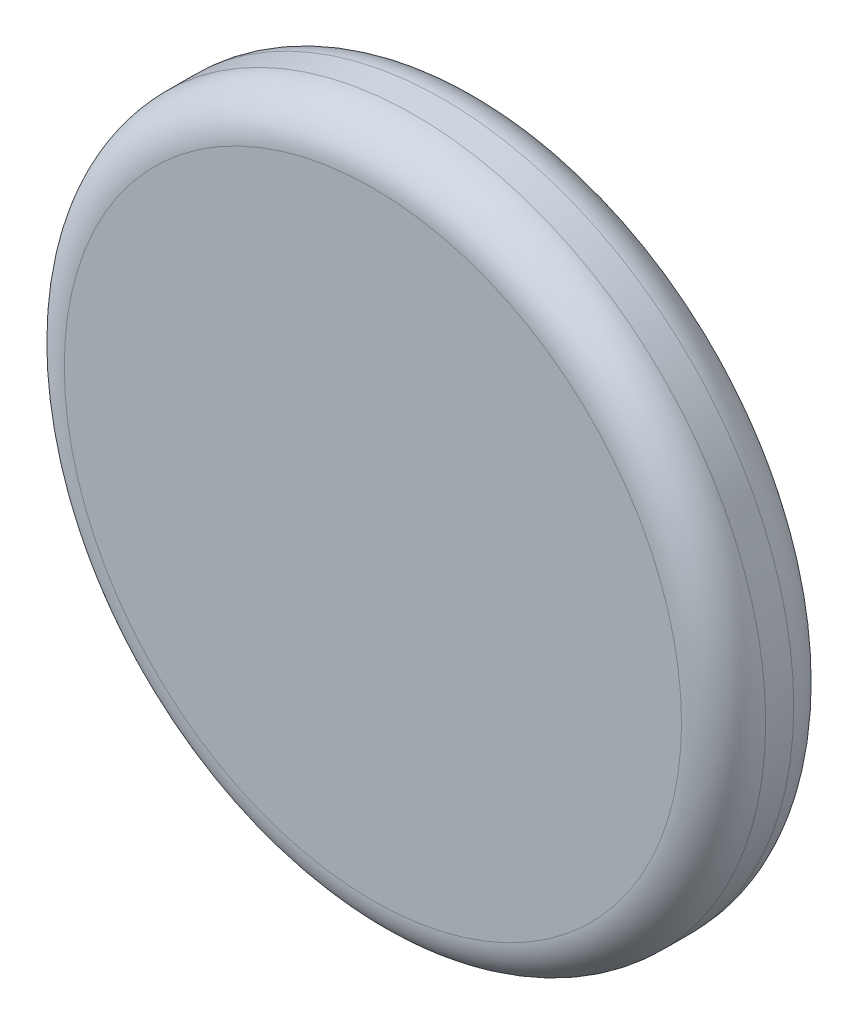
ISO-10303-21;
HEADER;
FILE_DESCRIPTION(('STEP AP214'),'2;1');
FILE_NAME('part.step','',(''),(''),'','','');
FILE_SCHEMA(('AUTOMOTIVE_DESIGN { 1 0 10303 214 1 1 1 1 }'));
ENDSEC;
DATA;
#1=APPLICATION_CONTEXT('core data for automotive mechanical design processes');
#2=APPLICATION_PROTOCOL_DEFINITION('international standard','automotive_design',2000,#1);
#3=PRODUCT_CONTEXT('',#1,'mechanical');
#4=PRODUCT('Part','Part','',(#3));
#5=PRODUCT_RELATED_PRODUCT_CATEGORY('part','',(#4));
#6=PRODUCT_DEFINITION_FORMATION('','',#4);
#7=PRODUCT_DEFINITION_CONTEXT('part definition',#1,'design');
#8=PRODUCT_DEFINITION('design','',#6,#7);
#9=PRODUCT_DEFINITION_SHAPE('','',#8);
#10=(LENGTH_UNIT() NAMED_UNIT(*) SI_UNIT(.MILLI.,.METRE.));
#11=(NAMED_UNIT(*) PLANE_ANGLE_UNIT() SI_UNIT($,.RADIAN.));
#12=(NAMED_UNIT(*) SI_UNIT($,.STERADIAN.) SOLID_ANGLE_UNIT());
#13=UNCERTAINTY_MEASURE_WITH_UNIT(LENGTH_MEASURE(1.E-05),#10,'distance_accuracy_value','');
#14=(GEOMETRIC_REPRESENTATION_CONTEXT(3) GLOBAL_UNCERTAINTY_ASSIGNED_CONTEXT((#13)) GLOBAL_UNIT_ASSIGNED_CONTEXT((#10,
#11,#12)) REPRESENTATION_CONTEXT('',''));
#15=CARTESIAN_POINT('',(0.,0.,0.));
#16=DIRECTION('',(0.,0.,1.));
#17=DIRECTION('',(1.,0.,0.));
#18=AXIS2_PLACEMENT_3D('',#15,#16,#17);
#19=CARTESIAN_POINT('',(0.,0.,4.));
#20=DIRECTION('',(0.,0.,-1.));
#21=DIRECTION('',(-1.,0.,0.));
#22=AXIS2_PLACEMENT_3D('',#19,#20,#21);
#23=CYLINDRICAL_SURFACE('',#22,12.5);
#24=CARTESIAN_POINT('',(0.,0.,1.5));
#25=DIRECTION('',(0.,0.,1.));
#26=DIRECTION('',(1.,0.,0.));
#27=AXIS2_PLACEMENT_3D('',#24,#25,#26);
#28=CIRCLE('',#27,12.5);
#29=CARTESIAN_POINT('',(12.5,0.,1.5));
#30=VERTEX_POINT('',#29);
#31=EDGE_CURVE('E42',#30,#30,#28,.T.);
#32=ORIENTED_EDGE('',*,*,#31,.T.);
#33=EDGE_LOOP('',(#32));
#34=FACE_BOUND('',#33,.T.);
#35=CARTESIAN_POINT('',(0.,0.,2.5));
#36=DIRECTION('',(0.,0.,1.));
#37=DIRECTION('',(1.,0.,0.));
#38=AXIS2_PLACEMENT_3D('',#35,#36,#37);
#39=CIRCLE('',#38,12.5);
#40=CARTESIAN_POINT('',(12.5,0.,2.5));
#41=VERTEX_POINT('',#40);
#42=EDGE_CURVE('E46',#41,#41,#39,.F.);
#43=ORIENTED_EDGE('',*,*,#42,.T.);
#44=EDGE_LOOP('',(#43));
#45=FACE_BOUND('',#44,.T.);
#46=ADVANCED_FACE('F31',(#34,#45),#23,.T.);
#47=CARTESIAN_POINT('',(0.,0.,4.));
#48=DIRECTION('',(0.,0.,1.));
#49=DIRECTION('',(1.,0.,0.));
#50=AXIS2_PLACEMENT_3D('',#47,#48,#49);
#51=PLANE('',#50);
#52=CARTESIAN_POINT('',(0.,0.,4.));
#53=DIRECTION('',(0.,0.,1.));
#54=DIRECTION('',(1.,0.,0.));
#55=AXIS2_PLACEMENT_3D('',#52,#53,#54);
#56=CIRCLE('',#55,11.);
#57=CARTESIAN_POINT('',(11.,0.,4.));
#58=VERTEX_POINT('',#57);
#59=EDGE_CURVE('E10',#58,#58,#56,.T.);
#60=ORIENTED_EDGE('',*,*,#59,.T.);
#61=EDGE_LOOP('',(#60));
#62=FACE_BOUND('',#61,.T.);
#63=ADVANCED_FACE('F62',(#62),#51,.T.);
#64=CARTESIAN_POINT('',(0.,0.,0.));
#65=DIRECTION('',(0.,0.,1.));
#66=DIRECTION('',(1.,0.,0.));
#67=AXIS2_PLACEMENT_3D('',#64,#65,#66);
#68=PLANE('',#67);
#69=CARTESIAN_POINT('',(0.,0.,0.));
#70=DIRECTION('',(0.,0.,1.));
#71=DIRECTION('',(1.,0.,0.));
#72=AXIS2_PLACEMENT_3D('',#69,#70,#71);
#73=CIRCLE('',#72,11.);
#74=CARTESIAN_POINT('',(11.,0.,0.));
#75=VERTEX_POINT('',#74);
#76=EDGE_CURVE('E38',#75,#75,#73,.F.);
#77=ORIENTED_EDGE('',*,*,#76,.T.);
#78=EDGE_LOOP('',(#77));
#79=FACE_BOUND('',#78,.T.);
#80=ADVANCED_FACE('F59',(#79),#68,.F.);
#81=CARTESIAN_POINT('',(0.,0.,1.5));
#82=DIRECTION('',(0.,0.,1.));
#83=DIRECTION('',(1.,0.,0.));
#84=AXIS2_PLACEMENT_3D('',#81,#82,#83);
#85=TOROIDAL_SURFACE('',#84,11.,1.5);
#86=ORIENTED_EDGE('',*,*,#76,.F.);
#87=EDGE_LOOP('',(#86));
#88=FACE_BOUND('',#87,.T.);
#89=ORIENTED_EDGE('',*,*,#31,.F.);
#90=EDGE_LOOP('',(#89));
#91=FACE_BOUND('',#90,.T.);
#92=ADVANCED_FACE('F55',(#88,#91),#85,.T.);
#93=CARTESIAN_POINT('',(0.,0.,2.5));
#94=DIRECTION('',(0.,0.,1.));
#95=DIRECTION('',(1.,0.,0.));
#96=AXIS2_PLACEMENT_3D('',#93,#94,#95);
#97=TOROIDAL_SURFACE('',#96,11.,1.5);
#98=ORIENTED_EDGE('',*,*,#42,.F.);
#99=EDGE_LOOP('',(#98));
#100=FACE_BOUND('',#99,.T.);
#101=ORIENTED_EDGE('',*,*,#59,.F.);
#102=EDGE_LOOP('',(#101));
#103=FACE_BOUND('',#102,.T.);
#104=ADVANCED_FACE('F33',(#100,#103),#97,.T.);
#105=CLOSED_SHELL('',(#46,#63,#80,#92,#104));
#106=MANIFOLD_SOLID_BREP('B2',#105);
#107=ADVANCED_BREP_SHAPE_REPRESENTATION('',(#18,#106),#14);
#108=SHAPE_DEFINITION_REPRESENTATION(#9,#107);
ENDSEC;
END-ISO-10303-21;
